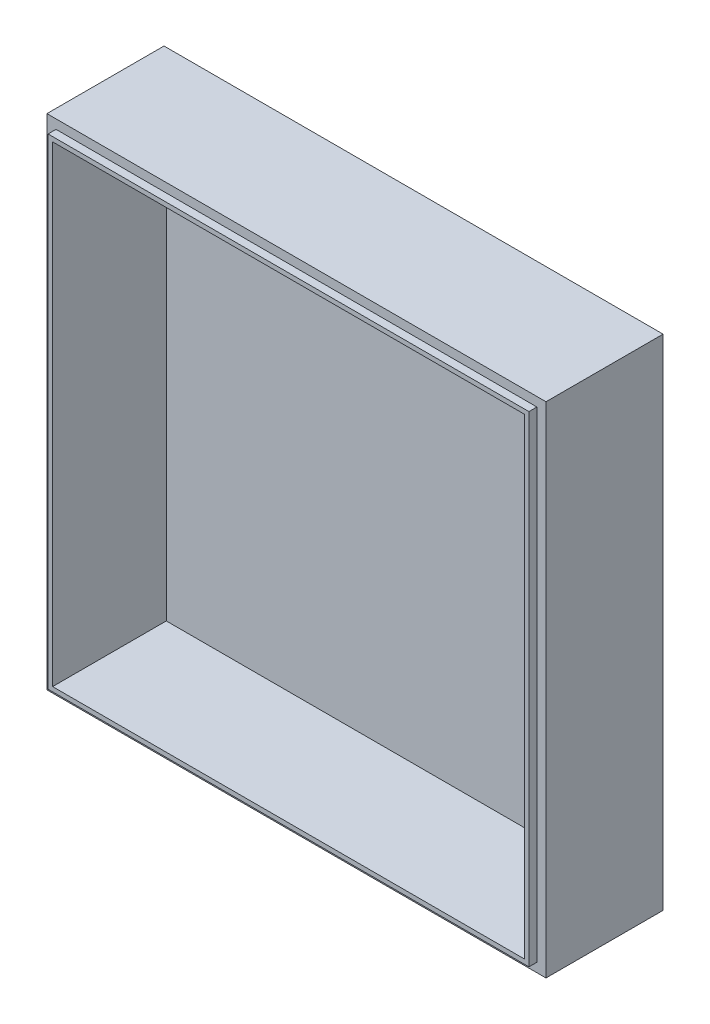
ISO-10303-21;
HEADER;
FILE_DESCRIPTION(('STEP AP214'),'2;1');
FILE_NAME('part.step','',(''),(''),'','','');
FILE_SCHEMA(('AUTOMOTIVE_DESIGN { 1 0 10303 214 1 1 1 1 }'));
ENDSEC;
DATA;
#1=APPLICATION_CONTEXT('core data for automotive mechanical design processes');
#2=APPLICATION_PROTOCOL_DEFINITION('international standard','automotive_design',2000,#1);
#3=PRODUCT_CONTEXT('',#1,'mechanical');
#4=PRODUCT('Part','Part','',(#3));
#5=PRODUCT_RELATED_PRODUCT_CATEGORY('part','',(#4));
#6=PRODUCT_DEFINITION_FORMATION('','',#4);
#7=PRODUCT_DEFINITION_CONTEXT('part definition',#1,'design');
#8=PRODUCT_DEFINITION('design','',#6,#7);
#9=PRODUCT_DEFINITION_SHAPE('','',#8);
#10=(LENGTH_UNIT() NAMED_UNIT(*) SI_UNIT(.MILLI.,.METRE.));
#11=(NAMED_UNIT(*) PLANE_ANGLE_UNIT() SI_UNIT($,.RADIAN.));
#12=(NAMED_UNIT(*) SI_UNIT($,.STERADIAN.) SOLID_ANGLE_UNIT());
#13=UNCERTAINTY_MEASURE_WITH_UNIT(LENGTH_MEASURE(1.E-05),#10,'distance_accuracy_value','');
#14=(GEOMETRIC_REPRESENTATION_CONTEXT(3) GLOBAL_UNCERTAINTY_ASSIGNED_CONTEXT((#13)) GLOBAL_UNIT_ASSIGNED_CONTEXT((#10,
#11,#12)) REPRESENTATION_CONTEXT('',''));
#15=CARTESIAN_POINT('',(0.,0.,0.));
#16=DIRECTION('',(0.,0.,1.));
#17=DIRECTION('',(1.,0.,0.));
#18=AXIS2_PLACEMENT_3D('',#15,#16,#17);
#19=CARTESIAN_POINT('',(0.,0.,20.));
#20=DIRECTION('',(0.,0.,-1.));
#21=DIRECTION('',(-1.,0.,0.));
#22=AXIS2_PLACEMENT_3D('',#19,#20,#21);
#23=PLANE('',#22);
#24=DIRECTION('',(0.,-1.,0.));
#25=VECTOR('',#24,1.);
#26=CARTESIAN_POINT('',(0.,0.,20.));
#27=LINE('',#26,#25);
#28=CARTESIAN_POINT('',(0.,83.,20.));
#29=VERTEX_POINT('',#28);
#30=CARTESIAN_POINT('',(0.,0.,20.));
#31=VERTEX_POINT('',#30);
#32=EDGE_CURVE('E169',#29,#31,#27,.T.);
#33=ORIENTED_EDGE('',*,*,#32,.F.);
#34=DIRECTION('',(-1.,0.,0.));
#35=VECTOR('',#34,1.);
#36=CARTESIAN_POINT('',(0.,83.,20.));
#37=LINE('',#36,#35);
#38=CARTESIAN_POINT('',(83.,83.,20.));
#39=VERTEX_POINT('',#38);
#40=EDGE_CURVE('E177',#39,#29,#37,.T.);
#41=ORIENTED_EDGE('',*,*,#40,.F.);
#42=DIRECTION('',(0.,1.,0.));
#43=VECTOR('',#42,1.);
#44=CARTESIAN_POINT('',(83.,0.,20.));
#45=LINE('',#44,#43);
#46=CARTESIAN_POINT('',(83.,0.,20.));
#47=VERTEX_POINT('',#46);
#48=EDGE_CURVE('E174',#47,#39,#45,.T.);
#49=ORIENTED_EDGE('',*,*,#48,.F.);
#50=DIRECTION('',(1.,0.,0.));
#51=VECTOR('',#50,1.);
#52=CARTESIAN_POINT('',(0.,0.,20.));
#53=LINE('',#52,#51);
#54=EDGE_CURVE('E171',#31,#47,#53,.T.);
#55=ORIENTED_EDGE('',*,*,#54,.F.);
#56=EDGE_LOOP('',(#33,#41,#49,#55));
#57=FACE_BOUND('',#56,.T.);
#58=DIRECTION('',(0.,-1.,0.));
#59=VECTOR('',#58,1.);
#60=CARTESIAN_POINT('',(-0.80000000000003,83.8,20.));
#61=LINE('',#60,#59);
#62=CARTESIAN_POINT('',(-0.80000000000003,83.8,20.));
#63=VERTEX_POINT('',#62);
#64=CARTESIAN_POINT('',(-0.80000000000003,-0.799999999999981,20.));
#65=VERTEX_POINT('',#64);
#66=EDGE_CURVE('E154',#63,#65,#61,.T.);
#67=ORIENTED_EDGE('',*,*,#66,.T.);
#68=DIRECTION('',(1.,0.,0.));
#69=VECTOR('',#68,1.);
#70=CARTESIAN_POINT('',(-0.80000000000003,-0.799999999999981,20.));
#71=LINE('',#70,#69);
#72=CARTESIAN_POINT('',(83.8,-0.799999999999981,20.));
#73=VERTEX_POINT('',#72);
#74=EDGE_CURVE('E128',#65,#73,#71,.T.);
#75=ORIENTED_EDGE('',*,*,#74,.T.);
#76=DIRECTION('',(0.,1.,0.));
#77=VECTOR('',#76,1.);
#78=CARTESIAN_POINT('',(83.8,83.8,20.));
#79=LINE('',#78,#77);
#80=CARTESIAN_POINT('',(83.8,83.8,20.));
#81=VERTEX_POINT('',#80);
#82=EDGE_CURVE('E56',#73,#81,#79,.T.);
#83=ORIENTED_EDGE('',*,*,#82,.T.);
#84=DIRECTION('',(-1.,0.,0.));
#85=VECTOR('',#84,1.);
#86=CARTESIAN_POINT('',(-0.80000000000003,83.8,20.));
#87=LINE('',#86,#85);
#88=EDGE_CURVE('E147',#81,#63,#87,.T.);
#89=ORIENTED_EDGE('',*,*,#88,.T.);
#90=EDGE_LOOP('',(#67,#75,#83,#89));
#91=FACE_BOUND('',#90,.T.);
#92=ADVANCED_FACE('F34',(#57,#91),#23,.F.);
#93=CARTESIAN_POINT('',(0.,0.,20.));
#94=DIRECTION('',(1.,0.,0.));
#95=DIRECTION('',(0.,0.,-1.));
#96=AXIS2_PLACEMENT_3D('',#93,#94,#95);
#97=PLANE('',#96);
#98=DIRECTION('',(0.,-1.,0.));
#99=VECTOR('',#98,1.);
#100=CARTESIAN_POINT('',(0.,0.,0.));
#101=LINE('',#100,#99);
#102=CARTESIAN_POINT('',(0.,83.,0.));
#103=VERTEX_POINT('',#102);
#104=CARTESIAN_POINT('',(0.,0.,0.));
#105=VERTEX_POINT('',#104);
#106=EDGE_CURVE('E168',#103,#105,#101,.T.);
#107=ORIENTED_EDGE('',*,*,#106,.F.);
#108=DIRECTION('',(0.,0.,-1.));
#109=VECTOR('',#108,1.);
#110=CARTESIAN_POINT('',(0.,83.,20.));
#111=LINE('',#110,#109);
#112=EDGE_CURVE('E179',#29,#103,#111,.T.);
#113=ORIENTED_EDGE('',*,*,#112,.F.);
#114=ORIENTED_EDGE('',*,*,#32,.T.);
#115=DIRECTION('',(0.,0.,-1.));
#116=VECTOR('',#115,1.);
#117=CARTESIAN_POINT('',(0.,0.,20.));
#118=LINE('',#117,#116);
#119=EDGE_CURVE('E195',#31,#105,#118,.T.);
#120=ORIENTED_EDGE('',*,*,#119,.T.);
#121=EDGE_LOOP('',(#107,#113,#114,#120));
#122=FACE_BOUND('',#121,.T.);
#123=ADVANCED_FACE('F245',(#122),#97,.T.);
#124=CARTESIAN_POINT('',(0.,0.,20.));
#125=DIRECTION('',(0.,1.,0.));
#126=DIRECTION('',(0.,0.,1.));
#127=AXIS2_PLACEMENT_3D('',#124,#125,#126);
#128=PLANE('',#127);
#129=DIRECTION('',(1.,0.,0.));
#130=VECTOR('',#129,1.);
#131=CARTESIAN_POINT('',(0.,0.,0.));
#132=LINE('',#131,#130);
#133=CARTESIAN_POINT('',(83.,0.,0.));
#134=VERTEX_POINT('',#133);
#135=EDGE_CURVE('E182',#105,#134,#132,.T.);
#136=ORIENTED_EDGE('',*,*,#135,.F.);
#137=ORIENTED_EDGE('',*,*,#119,.F.);
#138=ORIENTED_EDGE('',*,*,#54,.T.);
#139=DIRECTION('',(0.,0.,-1.));
#140=VECTOR('',#139,1.);
#141=CARTESIAN_POINT('',(83.,0.,20.));
#142=LINE('',#141,#140);
#143=EDGE_CURVE('E193',#47,#134,#142,.T.);
#144=ORIENTED_EDGE('',*,*,#143,.T.);
#145=EDGE_LOOP('',(#136,#137,#138,#144));
#146=FACE_BOUND('',#145,.T.);
#147=ADVANCED_FACE('F250',(#146),#128,.T.);
#148=CARTESIAN_POINT('',(83.,0.,20.));
#149=DIRECTION('',(-1.,0.,0.));
#150=DIRECTION('',(0.,0.,1.));
#151=AXIS2_PLACEMENT_3D('',#148,#149,#150);
#152=PLANE('',#151);
#153=DIRECTION('',(0.,1.,0.));
#154=VECTOR('',#153,1.);
#155=CARTESIAN_POINT('',(83.,0.,0.));
#156=LINE('',#155,#154);
#157=CARTESIAN_POINT('',(83.,83.,0.));
#158=VERTEX_POINT('',#157);
#159=EDGE_CURVE('E185',#134,#158,#156,.T.);
#160=ORIENTED_EDGE('',*,*,#159,.F.);
#161=ORIENTED_EDGE('',*,*,#143,.F.);
#162=ORIENTED_EDGE('',*,*,#48,.T.);
#163=DIRECTION('',(0.,0.,-1.));
#164=VECTOR('',#163,1.);
#165=CARTESIAN_POINT('',(83.,83.,20.));
#166=LINE('',#165,#164);
#167=EDGE_CURVE('E191',#39,#158,#166,.T.);
#168=ORIENTED_EDGE('',*,*,#167,.T.);
#169=EDGE_LOOP('',(#160,#161,#162,#168));
#170=FACE_BOUND('',#169,.T.);
#171=ADVANCED_FACE('F258',(#170),#152,.T.);
#172=CARTESIAN_POINT('',(0.,83.,20.));
#173=DIRECTION('',(0.,-1.,0.));
#174=DIRECTION('',(0.,0.,-1.));
#175=AXIS2_PLACEMENT_3D('',#172,#173,#174);
#176=PLANE('',#175);
#177=DIRECTION('',(-1.,0.,0.));
#178=VECTOR('',#177,1.);
#179=CARTESIAN_POINT('',(0.,83.,0.));
#180=LINE('',#179,#178);
#181=EDGE_CURVE('E172',#158,#103,#180,.T.);
#182=ORIENTED_EDGE('',*,*,#181,.F.);
#183=ORIENTED_EDGE('',*,*,#167,.F.);
#184=ORIENTED_EDGE('',*,*,#40,.T.);
#185=ORIENTED_EDGE('',*,*,#112,.T.);
#186=EDGE_LOOP('',(#182,#183,#184,#185));
#187=FACE_BOUND('',#186,.T.);
#188=ADVANCED_FACE('F262',(#187),#176,.T.);
#189=CARTESIAN_POINT('',(0.,0.,0.));
#190=DIRECTION('',(0.,0.,-1.));
#191=DIRECTION('',(-1.,0.,0.));
#192=AXIS2_PLACEMENT_3D('',#189,#190,#191);
#193=PLANE('',#192);
#194=ORIENTED_EDGE('',*,*,#181,.T.);
#195=ORIENTED_EDGE('',*,*,#106,.T.);
#196=ORIENTED_EDGE('',*,*,#135,.T.);
#197=ORIENTED_EDGE('',*,*,#159,.T.);
#198=EDGE_LOOP('',(#194,#195,#196,#197));
#199=FACE_BOUND('',#198,.T.);
#200=ADVANCED_FACE('F266',(#199),#193,.F.);
#201=CARTESIAN_POINT('',(41.5,41.5,18.6));
#202=DIRECTION('',(0.,0.,1.));
#203=DIRECTION('',(1.,0.,0.));
#204=AXIS2_PLACEMENT_3D('',#201,#202,#203);
#205=PLANE('',#204);
#206=DIRECTION('',(-1.,0.,0.));
#207=VECTOR('',#206,1.);
#208=CARTESIAN_POINT('',(-0.80000000000003,83.8,18.6));
#209=LINE('',#208,#207);
#210=CARTESIAN_POINT('',(83.8,83.8,18.6));
#211=VERTEX_POINT('',#210);
#212=CARTESIAN_POINT('',(-0.80000000000003,83.8,18.6));
#213=VERTEX_POINT('',#212);
#214=EDGE_CURVE('E134',#211,#213,#209,.T.);
#215=ORIENTED_EDGE('',*,*,#214,.F.);
#216=DIRECTION('',(0.,1.,0.));
#217=VECTOR('',#216,1.);
#218=CARTESIAN_POINT('',(83.8,83.8,18.6));
#219=LINE('',#218,#217);
#220=CARTESIAN_POINT('',(83.8,-0.799999999999981,18.6));
#221=VERTEX_POINT('',#220);
#222=EDGE_CURVE('E143',#221,#211,#219,.T.);
#223=ORIENTED_EDGE('',*,*,#222,.F.);
#224=DIRECTION('',(1.,0.,0.));
#225=VECTOR('',#224,1.);
#226=CARTESIAN_POINT('',(-0.80000000000003,-0.799999999999981,18.6));
#227=LINE('',#226,#225);
#228=CARTESIAN_POINT('',(-0.80000000000003,-0.799999999999981,18.6));
#229=VERTEX_POINT('',#228);
#230=EDGE_CURVE('E126',#229,#221,#227,.T.);
#231=ORIENTED_EDGE('',*,*,#230,.F.);
#232=DIRECTION('',(0.,-1.,0.));
#233=VECTOR('',#232,1.);
#234=CARTESIAN_POINT('',(-0.80000000000003,83.8,18.6));
#235=LINE('',#234,#233);
#236=EDGE_CURVE('E140',#213,#229,#235,.T.);
#237=ORIENTED_EDGE('',*,*,#236,.F.);
#238=EDGE_LOOP('',(#215,#223,#231,#237));
#239=FACE_BOUND('',#238,.T.);
#240=DIRECTION('',(0.,-1.,0.));
#241=VECTOR('',#240,1.);
#242=CARTESIAN_POINT('',(-2.4,-2.4,18.6));
#243=LINE('',#242,#241);
#244=CARTESIAN_POINT('',(-2.4,85.4,18.6));
#245=VERTEX_POINT('',#244);
#246=CARTESIAN_POINT('',(-2.4,-2.4,18.6));
#247=VERTEX_POINT('',#246);
#248=EDGE_CURVE('E49',#245,#247,#243,.T.);
#249=ORIENTED_EDGE('',*,*,#248,.T.);
#250=DIRECTION('',(-1.,0.,0.));
#251=VECTOR('',#250,1.);
#252=CARTESIAN_POINT('',(-2.4,-2.4,18.6));
#253=LINE('',#252,#251);
#254=CARTESIAN_POINT('',(85.4,-2.4,18.6));
#255=VERTEX_POINT('',#254);
#256=EDGE_CURVE('E12',#255,#247,#253,.T.);
#257=ORIENTED_EDGE('',*,*,#256,.F.);
#258=DIRECTION('',(0.,-1.,0.));
#259=VECTOR('',#258,1.);
#260=CARTESIAN_POINT('',(85.4,-2.4,18.6));
#261=LINE('',#260,#259);
#262=CARTESIAN_POINT('',(85.4,85.4,18.6));
#263=VERTEX_POINT('',#262);
#264=EDGE_CURVE('E159',#263,#255,#261,.T.);
#265=ORIENTED_EDGE('',*,*,#264,.F.);
#266=DIRECTION('',(-1.,0.,0.));
#267=VECTOR('',#266,1.);
#268=CARTESIAN_POINT('',(-2.4,85.4,18.6));
#269=LINE('',#268,#267);
#270=EDGE_CURVE('E165',#263,#245,#269,.T.);
#271=ORIENTED_EDGE('',*,*,#270,.T.);
#272=EDGE_LOOP('',(#249,#257,#265,#271));
#273=FACE_BOUND('',#272,.T.);
#274=ADVANCED_FACE('F139',(#239,#273),#205,.T.);
#275=CARTESIAN_POINT('',(-0.80000000000003,83.8,18.6));
#276=DIRECTION('',(-1.,0.,0.));
#277=DIRECTION('',(0.,0.,1.));
#278=AXIS2_PLACEMENT_3D('',#275,#276,#277);
#279=PLANE('',#278);
#280=ORIENTED_EDGE('',*,*,#66,.F.);
#281=DIRECTION('',(0.,0.,1.));
#282=VECTOR('',#281,1.);
#283=CARTESIAN_POINT('',(-0.80000000000003,83.8,18.6));
#284=LINE('',#283,#282);
#285=EDGE_CURVE('E146',#213,#63,#284,.T.);
#286=ORIENTED_EDGE('',*,*,#285,.F.);
#287=ORIENTED_EDGE('',*,*,#236,.T.);
#288=DIRECTION('',(0.,0.,1.));
#289=VECTOR('',#288,1.);
#290=CARTESIAN_POINT('',(-0.80000000000003,-0.799999999999981,18.6));
#291=LINE('',#290,#289);
#292=EDGE_CURVE('E123',#229,#65,#291,.T.);
#293=ORIENTED_EDGE('',*,*,#292,.T.);
#294=EDGE_LOOP('',(#280,#286,#287,#293));
#295=FACE_BOUND('',#294,.T.);
#296=ADVANCED_FACE('F145',(#295),#279,.T.);
#297=CARTESIAN_POINT('',(-0.80000000000003,83.8,18.6));
#298=DIRECTION('',(0.,1.,0.));
#299=DIRECTION('',(0.,0.,1.));
#300=AXIS2_PLACEMENT_3D('',#297,#298,#299);
#301=PLANE('',#300);
#302=ORIENTED_EDGE('',*,*,#88,.F.);
#303=DIRECTION('',(0.,0.,1.));
#304=VECTOR('',#303,1.);
#305=CARTESIAN_POINT('',(83.8,83.8,18.6));
#306=LINE('',#305,#304);
#307=EDGE_CURVE('E160',#211,#81,#306,.T.);
#308=ORIENTED_EDGE('',*,*,#307,.F.);
#309=ORIENTED_EDGE('',*,*,#214,.T.);
#310=ORIENTED_EDGE('',*,*,#285,.T.);
#311=EDGE_LOOP('',(#302,#308,#309,#310));
#312=FACE_BOUND('',#311,.T.);
#313=ADVANCED_FACE('F271',(#312),#301,.T.);
#314=CARTESIAN_POINT('',(83.8,83.8,18.6));
#315=DIRECTION('',(1.,0.,0.));
#316=DIRECTION('',(0.,0.,-1.));
#317=AXIS2_PLACEMENT_3D('',#314,#315,#316);
#318=PLANE('',#317);
#319=ORIENTED_EDGE('',*,*,#82,.F.);
#320=DIRECTION('',(0.,0.,1.));
#321=VECTOR('',#320,1.);
#322=CARTESIAN_POINT('',(83.8,-0.799999999999981,18.6));
#323=LINE('',#322,#321);
#324=EDGE_CURVE('E133',#221,#73,#323,.T.);
#325=ORIENTED_EDGE('',*,*,#324,.F.);
#326=ORIENTED_EDGE('',*,*,#222,.T.);
#327=ORIENTED_EDGE('',*,*,#307,.T.);
#328=EDGE_LOOP('',(#319,#325,#326,#327));
#329=FACE_BOUND('',#328,.T.);
#330=ADVANCED_FACE('F240',(#329),#318,.T.);
#331=CARTESIAN_POINT('',(-0.80000000000003,-0.799999999999981,18.6));
#332=DIRECTION('',(0.,-1.,0.));
#333=DIRECTION('',(0.,0.,-1.));
#334=AXIS2_PLACEMENT_3D('',#331,#332,#333);
#335=PLANE('',#334);
#336=ORIENTED_EDGE('',*,*,#74,.F.);
#337=ORIENTED_EDGE('',*,*,#292,.F.);
#338=ORIENTED_EDGE('',*,*,#230,.T.);
#339=ORIENTED_EDGE('',*,*,#324,.T.);
#340=EDGE_LOOP('',(#336,#337,#338,#339));
#341=FACE_BOUND('',#340,.T.);
#342=ADVANCED_FACE('F125',(#341),#335,.T.);
#343=CARTESIAN_POINT('',(0.,0.,-2.));
#344=DIRECTION('',(0.,0.,-1.));
#345=DIRECTION('',(-1.,0.,0.));
#346=AXIS2_PLACEMENT_3D('',#343,#344,#345);
#347=PLANE('',#346);
#348=DIRECTION('',(0.,1.,0.));
#349=VECTOR('',#348,1.);
#350=CARTESIAN_POINT('',(-2.4,-2.4,-2.));
#351=LINE('',#350,#349);
#352=CARTESIAN_POINT('',(-2.4,-2.4,-2.));
#353=VERTEX_POINT('',#352);
#354=CARTESIAN_POINT('',(-2.4,85.4,-2.));
#355=VERTEX_POINT('',#354);
#356=EDGE_CURVE('E198',#353,#355,#351,.T.);
#357=ORIENTED_EDGE('',*,*,#356,.T.);
#358=DIRECTION('',(1.,0.,0.));
#359=VECTOR('',#358,1.);
#360=CARTESIAN_POINT('',(-2.4,85.4,-2.));
#361=LINE('',#360,#359);
#362=CARTESIAN_POINT('',(85.4,85.4,-2.));
#363=VERTEX_POINT('',#362);
#364=EDGE_CURVE('E201',#355,#363,#361,.T.);
#365=ORIENTED_EDGE('',*,*,#364,.T.);
#366=DIRECTION('',(0.,1.,0.));
#367=VECTOR('',#366,1.);
#368=CARTESIAN_POINT('',(85.4,-2.4,-2.));
#369=LINE('',#368,#367);
#370=CARTESIAN_POINT('',(85.4,-2.4,-2.));
#371=VERTEX_POINT('',#370);
#372=EDGE_CURVE('E203',#371,#363,#369,.T.);
#373=ORIENTED_EDGE('',*,*,#372,.F.);
#374=DIRECTION('',(1.,0.,0.));
#375=VECTOR('',#374,1.);
#376=CARTESIAN_POINT('',(-2.4,-2.4,-2.));
#377=LINE('',#376,#375);
#378=EDGE_CURVE('E206',#353,#371,#377,.T.);
#379=ORIENTED_EDGE('',*,*,#378,.F.);
#380=EDGE_LOOP('',(#357,#365,#373,#379));
#381=FACE_BOUND('',#380,.T.);
#382=ADVANCED_FACE('F232',(#381),#347,.T.);
#383=CARTESIAN_POINT('',(-2.4,-2.4,-2.));
#384=DIRECTION('',(0.,-1.,0.));
#385=DIRECTION('',(0.,0.,-1.));
#386=AXIS2_PLACEMENT_3D('',#383,#384,#385);
#387=PLANE('',#386);
#388=DIRECTION('',(0.,0.,1.));
#389=VECTOR('',#388,1.);
#390=CARTESIAN_POINT('',(85.4,-2.4,-2.));
#391=LINE('',#390,#389);
#392=EDGE_CURVE('E212',#371,#255,#391,.T.);
#393=ORIENTED_EDGE('',*,*,#392,.T.);
#394=ORIENTED_EDGE('',*,*,#256,.T.);
#395=DIRECTION('',(0.,0.,1.));
#396=VECTOR('',#395,1.);
#397=CARTESIAN_POINT('',(-2.4,-2.4,-2.));
#398=LINE('',#397,#396);
#399=EDGE_CURVE('E209',#353,#247,#398,.T.);
#400=ORIENTED_EDGE('',*,*,#399,.F.);
#401=ORIENTED_EDGE('',*,*,#378,.T.);
#402=EDGE_LOOP('',(#393,#394,#400,#401));
#403=FACE_BOUND('',#402,.T.);
#404=ADVANCED_FACE('F227',(#403),#387,.T.);
#405=CARTESIAN_POINT('',(85.4,-2.4,-2.));
#406=DIRECTION('',(1.,0.,0.));
#407=DIRECTION('',(0.,0.,-1.));
#408=AXIS2_PLACEMENT_3D('',#405,#406,#407);
#409=PLANE('',#408);
#410=DIRECTION('',(0.,0.,1.));
#411=VECTOR('',#410,1.);
#412=CARTESIAN_POINT('',(85.4,85.4,-2.));
#413=LINE('',#412,#411);
#414=EDGE_CURVE('E215',#363,#263,#413,.T.);
#415=ORIENTED_EDGE('',*,*,#414,.T.);
#416=ORIENTED_EDGE('',*,*,#264,.T.);
#417=ORIENTED_EDGE('',*,*,#392,.F.);
#418=ORIENTED_EDGE('',*,*,#372,.T.);
#419=EDGE_LOOP('',(#415,#416,#417,#418));
#420=FACE_BOUND('',#419,.T.);
#421=ADVANCED_FACE('F229',(#420),#409,.T.);
#422=CARTESIAN_POINT('',(-2.4,85.4,-2.));
#423=DIRECTION('',(0.,-1.,0.));
#424=DIRECTION('',(0.,0.,-1.));
#425=AXIS2_PLACEMENT_3D('',#422,#423,#424);
#426=PLANE('',#425);
#427=ORIENTED_EDGE('',*,*,#270,.F.);
#428=ORIENTED_EDGE('',*,*,#414,.F.);
#429=ORIENTED_EDGE('',*,*,#364,.F.);
#430=DIRECTION('',(0.,0.,1.));
#431=VECTOR('',#430,1.);
#432=CARTESIAN_POINT('',(-2.4,85.4,-2.));
#433=LINE('',#432,#431);
#434=EDGE_CURVE('E42',#355,#245,#433,.T.);
#435=ORIENTED_EDGE('',*,*,#434,.T.);
#436=EDGE_LOOP('',(#427,#428,#429,#435));
#437=FACE_BOUND('',#436,.T.);
#438=ADVANCED_FACE('F221',(#437),#426,.F.);
#439=CARTESIAN_POINT('',(-2.4,-2.4,-2.));
#440=DIRECTION('',(1.,0.,0.));
#441=DIRECTION('',(0.,0.,-1.));
#442=AXIS2_PLACEMENT_3D('',#439,#440,#441);
#443=PLANE('',#442);
#444=ORIENTED_EDGE('',*,*,#248,.F.);
#445=ORIENTED_EDGE('',*,*,#434,.F.);
#446=ORIENTED_EDGE('',*,*,#356,.F.);
#447=ORIENTED_EDGE('',*,*,#399,.T.);
#448=EDGE_LOOP('',(#444,#445,#446,#447));
#449=FACE_BOUND('',#448,.T.);
#450=ADVANCED_FACE('F36',(#449),#443,.F.);
#451=CLOSED_SHELL('',(#92,#123,#147,#171,#188,#200,#274,#296,#313,#330,#342,#382,#404,#421,#438,#450));
#452=MANIFOLD_SOLID_BREP('B2',#451);
#453=ADVANCED_BREP_SHAPE_REPRESENTATION('',(#18,#452),#14);
#454=SHAPE_DEFINITION_REPRESENTATION(#9,#453);
ENDSEC;
END-ISO-10303-21;
